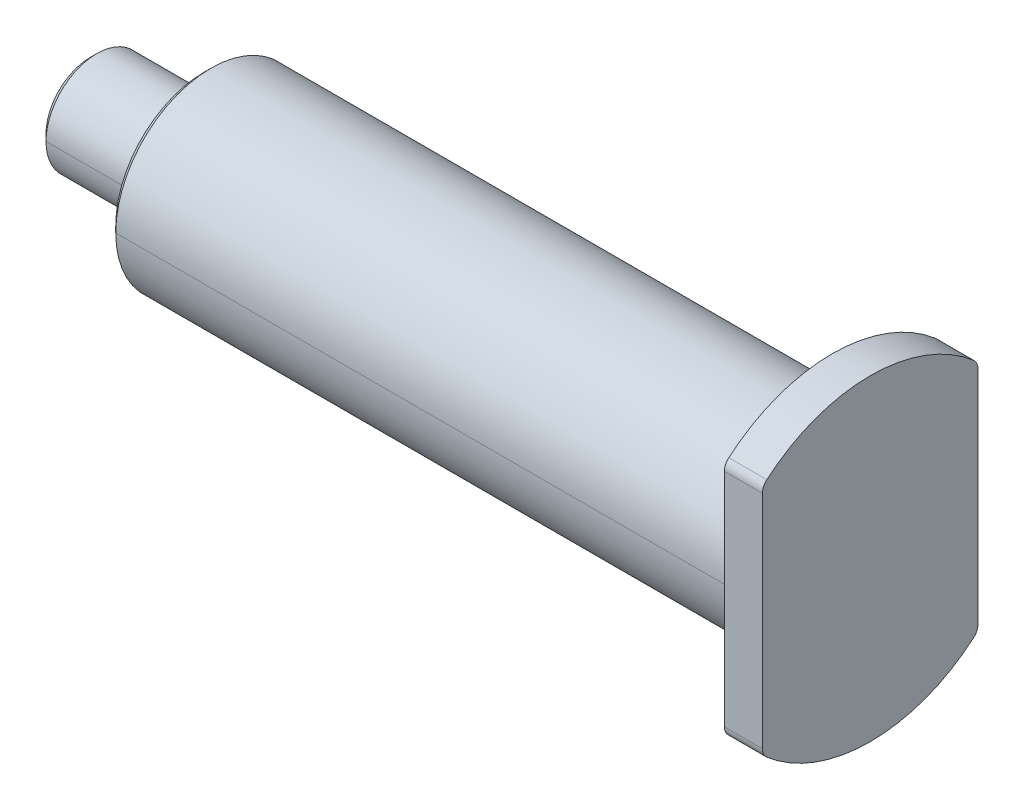
ISO-10303-21;
HEADER;
FILE_DESCRIPTION(('STEP AP214'),'2;1');
FILE_NAME('part.step','',(''),(''),'','','');
FILE_SCHEMA(('AUTOMOTIVE_DESIGN { 1 0 10303 214 1 1 1 1 }'));
ENDSEC;
DATA;
#1=APPLICATION_CONTEXT('core data for automotive mechanical design processes');
#2=APPLICATION_PROTOCOL_DEFINITION('international standard','automotive_design',2000,#1);
#3=PRODUCT_CONTEXT('',#1,'mechanical');
#4=PRODUCT('Part','Part','',(#3));
#5=PRODUCT_RELATED_PRODUCT_CATEGORY('part','',(#4));
#6=PRODUCT_DEFINITION_FORMATION('','',#4);
#7=PRODUCT_DEFINITION_CONTEXT('part definition',#1,'design');
#8=PRODUCT_DEFINITION('design','',#6,#7);
#9=PRODUCT_DEFINITION_SHAPE('','',#8);
#10=(LENGTH_UNIT() NAMED_UNIT(*) SI_UNIT(.MILLI.,.METRE.));
#11=(NAMED_UNIT(*) PLANE_ANGLE_UNIT() SI_UNIT($,.RADIAN.));
#12=(NAMED_UNIT(*) SI_UNIT($,.STERADIAN.) SOLID_ANGLE_UNIT());
#13=UNCERTAINTY_MEASURE_WITH_UNIT(LENGTH_MEASURE(1.E-05),#10,'distance_accuracy_value','');
#14=(GEOMETRIC_REPRESENTATION_CONTEXT(3) GLOBAL_UNCERTAINTY_ASSIGNED_CONTEXT((#13)) GLOBAL_UNIT_ASSIGNED_CONTEXT((#10,
#11,#12)) REPRESENTATION_CONTEXT('',''));
#15=CARTESIAN_POINT('',(0.,0.,0.));
#16=DIRECTION('',(0.,0.,1.));
#17=DIRECTION('',(1.,0.,0.));
#18=AXIS2_PLACEMENT_3D('',#15,#16,#17);
#19=CARTESIAN_POINT('',(150.5,-749.2177978871,1.5));
#20=DIRECTION('',(1.,0.,0.));
#21=DIRECTION('',(0.,0.,1.));
#22=AXIS2_PLACEMENT_3D('',#19,#20,#21);
#23=CYLINDRICAL_SURFACE('',#22,1.);
#24=CARTESIAN_POINT('',(153.5,-749.2177978871,1.5));
#25=DIRECTION('',(1.,0.,0.));
#26=DIRECTION('',(0.,-0.75806938148642,-0.652173913042217));
#27=AXIS2_PLACEMENT_3D('',#24,#25,#26);
#28=CIRCLE('',#27,1.);
#29=CARTESIAN_POINT('',(153.5,-749.9758672686,0.8478260869573));
#30=VERTEX_POINT('',#29);
#31=CARTESIAN_POINT('',(153.5,-749.2177978871,0.5));
#32=VERTEX_POINT('',#31);
#33=EDGE_CURVE('E250',#30,#32,#28,.T.);
#34=ORIENTED_EDGE('',*,*,#33,.F.);
#35=DIRECTION('',(1.,0.,0.));
#36=VECTOR('',#35,1.);
#37=CARTESIAN_POINT('',(150.5,-749.9758672686,0.8478260869573));
#38=LINE('',#37,#36);
#39=CARTESIAN_POINT('',(150.5,-749.9758672686,0.8478260869576));
#40=VERTEX_POINT('',#39);
#41=EDGE_CURVE('E11',#40,#30,#38,.T.);
#42=ORIENTED_EDGE('',*,*,#41,.F.);
#43=CARTESIAN_POINT('',(150.5,-749.2177978871,1.5));
#44=DIRECTION('',(-1.,0.,0.));
#45=DIRECTION('',(0.,1.136868377216E-13,-1.));
#46=AXIS2_PLACEMENT_3D('',#43,#44,#45);
#47=CIRCLE('',#46,1.);
#48=CARTESIAN_POINT('',(150.5,-749.2177978871,0.5));
#49=VERTEX_POINT('',#48);
#50=EDGE_CURVE('E260',#49,#40,#47,.T.);
#51=ORIENTED_EDGE('',*,*,#50,.F.);
#52=DIRECTION('',(1.,0.,0.));
#53=VECTOR('',#52,1.);
#54=CARTESIAN_POINT('',(150.5,-749.2177978871,0.5));
#55=LINE('',#54,#53);
#56=EDGE_CURVE('E275',#49,#32,#55,.T.);
#57=ORIENTED_EDGE('',*,*,#56,.T.);
#58=EDGE_LOOP('',(#34,#42,#51,#57));
#59=FACE_BOUND('',#58,.T.);
#60=ADVANCED_FACE('F17',(#59),#23,.T.);
#61=CARTESIAN_POINT('',(150.5,-740.5,9.));
#62=DIRECTION('',(1.,0.,0.));
#63=DIRECTION('',(0.,0.,1.));
#64=AXIS2_PLACEMENT_3D('',#61,#62,#63);
#65=CYLINDRICAL_SURFACE('',#64,12.5);
#66=CARTESIAN_POINT('',(150.5,-740.5,9.));
#67=DIRECTION('',(-1.,0.,0.));
#68=DIRECTION('',(0.,-0.758069381485401,-0.652173913043401));
#69=AXIS2_PLACEMENT_3D('',#66,#67,#68);
#70=CIRCLE('',#69,12.5);
#71=CARTESIAN_POINT('',(150.5,-749.9758672686,17.15217391304));
#72=VERTEX_POINT('',#71);
#73=EDGE_CURVE('E255',#40,#72,#70,.T.);
#74=ORIENTED_EDGE('',*,*,#73,.F.);
#75=ORIENTED_EDGE('',*,*,#41,.T.);
#76=CARTESIAN_POINT('',(153.5,-740.5,9.));
#77=DIRECTION('',(1.,0.,0.));
#78=DIRECTION('',(0.,-0.758069381485401,0.652173913043401));
#79=AXIS2_PLACEMENT_3D('',#76,#77,#78);
#80=CIRCLE('',#79,12.5);
#81=CARTESIAN_POINT('',(153.5,-749.9758672686,17.15217391304));
#82=VERTEX_POINT('',#81);
#83=EDGE_CURVE('E246',#82,#30,#80,.T.);
#84=ORIENTED_EDGE('',*,*,#83,.F.);
#85=DIRECTION('',(-1.,0.,0.));
#86=VECTOR('',#85,1.);
#87=CARTESIAN_POINT('',(153.5,-749.9758672686,17.15217391304));
#88=LINE('',#87,#86);
#89=EDGE_CURVE('E26',#82,#72,#88,.T.);
#90=ORIENTED_EDGE('',*,*,#89,.T.);
#91=EDGE_LOOP('',(#74,#75,#84,#90));
#92=FACE_BOUND('',#91,.T.);
#93=ADVANCED_FACE('F367',(#92),#65,.T.);
#94=CARTESIAN_POINT('',(150.5,-749.2177978871,16.5));
#95=DIRECTION('',(1.,0.,0.));
#96=DIRECTION('',(0.,0.,1.));
#97=AXIS2_PLACEMENT_3D('',#94,#95,#96);
#98=CYLINDRICAL_SURFACE('',#97,1.);
#99=CARTESIAN_POINT('',(153.5,-749.2177978871,16.5));
#100=DIRECTION('',(1.,0.,0.));
#101=DIRECTION('',(0.,1.136868377216E-13,1.));
#102=AXIS2_PLACEMENT_3D('',#99,#100,#101);
#103=CIRCLE('',#102,1.);
#104=CARTESIAN_POINT('',(153.5,-749.2177978871,17.5));
#105=VERTEX_POINT('',#104);
#106=EDGE_CURVE('E251',#105,#82,#103,.T.);
#107=ORIENTED_EDGE('',*,*,#106,.F.);
#108=DIRECTION('',(-1.,0.,0.));
#109=VECTOR('',#108,1.);
#110=CARTESIAN_POINT('',(153.5,-749.2177978871,17.5));
#111=LINE('',#110,#109);
#112=CARTESIAN_POINT('',(150.5,-749.2177978871,17.5));
#113=VERTEX_POINT('',#112);
#114=EDGE_CURVE('E179',#105,#113,#111,.T.);
#115=ORIENTED_EDGE('',*,*,#114,.T.);
#116=CARTESIAN_POINT('',(150.5,-749.2177978871,16.5));
#117=DIRECTION('',(-1.,0.,0.));
#118=DIRECTION('',(0.,-0.75806938148642,0.652173913042217));
#119=AXIS2_PLACEMENT_3D('',#116,#117,#118);
#120=CIRCLE('',#119,1.);
#121=EDGE_CURVE('E259',#72,#113,#120,.T.);
#122=ORIENTED_EDGE('',*,*,#121,.F.);
#123=ORIENTED_EDGE('',*,*,#89,.F.);
#124=EDGE_LOOP('',(#107,#115,#122,#123));
#125=FACE_BOUND('',#124,.T.);
#126=ADVANCED_FACE('F366',(#125),#98,.T.);
#127=CARTESIAN_POINT('',(150.5,-740.5,17.5));
#128=DIRECTION('',(0.,0.,1.));
#129=DIRECTION('',(1.,0.,0.));
#130=AXIS2_PLACEMENT_3D('',#127,#128,#129);
#131=PLANE('',#130);
#132=DIRECTION('',(0.,-1.,0.));
#133=VECTOR('',#132,1.);
#134=CARTESIAN_POINT('',(150.5,-731.7822021129,17.5));
#135=LINE('',#134,#133);
#136=CARTESIAN_POINT('',(150.5,-731.7822021129,17.5));
#137=VERTEX_POINT('',#136);
#138=EDGE_CURVE('E276',#137,#113,#135,.T.);
#139=ORIENTED_EDGE('',*,*,#138,.T.);
#140=ORIENTED_EDGE('',*,*,#114,.F.);
#141=DIRECTION('',(0.,-1.,0.));
#142=VECTOR('',#141,1.);
#143=CARTESIAN_POINT('',(153.5,-731.7822021129,17.5));
#144=LINE('',#143,#142);
#145=CARTESIAN_POINT('',(153.5,-731.7822021129,17.5));
#146=VERTEX_POINT('',#145);
#147=EDGE_CURVE('E245',#146,#105,#144,.T.);
#148=ORIENTED_EDGE('',*,*,#147,.F.);
#149=DIRECTION('',(1.,0.,0.));
#150=VECTOR('',#149,1.);
#151=CARTESIAN_POINT('',(150.5,-731.7822021129,17.5));
#152=LINE('',#151,#150);
#153=EDGE_CURVE('E177',#137,#146,#152,.T.);
#154=ORIENTED_EDGE('',*,*,#153,.F.);
#155=EDGE_LOOP('',(#139,#140,#148,#154));
#156=FACE_BOUND('',#155,.T.);
#157=ADVANCED_FACE('F370',(#156),#131,.T.);
#158=CARTESIAN_POINT('',(150.5,-731.7822021129,16.5));
#159=DIRECTION('',(1.,0.,0.));
#160=DIRECTION('',(0.,0.,1.));
#161=AXIS2_PLACEMENT_3D('',#158,#159,#160);
#162=CYLINDRICAL_SURFACE('',#161,1.);
#163=CARTESIAN_POINT('',(153.5,-731.7822021129,16.5));
#164=DIRECTION('',(1.,0.,0.));
#165=DIRECTION('',(0.,0.758069381486186,0.652173913042488));
#166=AXIS2_PLACEMENT_3D('',#163,#164,#165);
#167=CIRCLE('',#166,1.);
#168=CARTESIAN_POINT('',(153.5,-731.0241327314,17.15217391304));
#169=VERTEX_POINT('',#168);
#170=EDGE_CURVE('E241',#169,#146,#167,.T.);
#171=ORIENTED_EDGE('',*,*,#170,.F.);
#172=DIRECTION('',(1.,0.,0.));
#173=VECTOR('',#172,1.);
#174=CARTESIAN_POINT('',(150.5,-731.0241327314,17.15217391304));
#175=LINE('',#174,#173);
#176=CARTESIAN_POINT('',(150.5,-731.0241327314,17.15217391304));
#177=VERTEX_POINT('',#176);
#178=EDGE_CURVE('E356',#177,#169,#175,.T.);
#179=ORIENTED_EDGE('',*,*,#178,.F.);
#180=CARTESIAN_POINT('',(150.5,-731.7822021129,16.5));
#181=DIRECTION('',(-1.,0.,0.));
#182=DIRECTION('',(0.,0.,1.));
#183=AXIS2_PLACEMENT_3D('',#180,#181,#182);
#184=CIRCLE('',#183,1.);
#185=EDGE_CURVE('E279',#137,#177,#184,.T.);
#186=ORIENTED_EDGE('',*,*,#185,.F.);
#187=ORIENTED_EDGE('',*,*,#153,.T.);
#188=EDGE_LOOP('',(#171,#179,#186,#187));
#189=FACE_BOUND('',#188,.T.);
#190=ADVANCED_FACE('F374',(#189),#162,.T.);
#191=CARTESIAN_POINT('',(79.2867965644,-740.5,9.));
#192=DIRECTION('',(1.,0.,0.));
#193=DIRECTION('',(0.,0.,1.));
#194=AXIS2_PLACEMENT_3D('',#191,#192,#193);
#195=CYLINDRICAL_SURFACE('',#194,7.5);
#196=DIRECTION('',(1.,-4.881341589389E-11,-1.033117355826E-11));
#197=VECTOR('',#196,1.);
#198=CARTESIAN_POINT('',(101.4999999995,-740.4999999976,1.500000000506));
#199=LINE('',#198,#197);
#200=CARTESIAN_POINT('',(101.5,-740.5,1.5));
#201=VERTEX_POINT('',#200);
#202=CARTESIAN_POINT('',(150.5,-740.5,1.5));
#203=VERTEX_POINT('',#202);
#204=EDGE_CURVE('E196',#201,#203,#199,.T.);
#205=ORIENTED_EDGE('',*,*,#204,.T.);
#206=CARTESIAN_POINT('',(150.5,-740.5,9.));
#207=DIRECTION('',(1.,0.,0.));
#208=DIRECTION('',(0.,0.,1.));
#209=AXIS2_PLACEMENT_3D('',#206,#207,#208);
#210=CIRCLE('',#209,7.5);
#211=CARTESIAN_POINT('',(150.5,-740.5,16.5));
#212=VERTEX_POINT('',#211);
#213=EDGE_CURVE('E282',#212,#203,#210,.T.);
#214=ORIENTED_EDGE('',*,*,#213,.F.);
#215=DIRECTION('',(1.,4.881341589389E-11,1.033121887348E-11));
#216=VECTOR('',#215,1.);
#217=CARTESIAN_POINT('',(101.4999999995,-740.5000000024,16.49999999949));
#218=LINE('',#217,#216);
#219=CARTESIAN_POINT('',(101.5,-740.5,16.5));
#220=VERTEX_POINT('',#219);
#221=EDGE_CURVE('E194',#220,#212,#218,.T.);
#222=ORIENTED_EDGE('',*,*,#221,.F.);
#223=CARTESIAN_POINT('',(101.5,-740.5,9.));
#224=DIRECTION('',(-1.,0.,0.));
#225=DIRECTION('',(0.,0.,-1.));
#226=AXIS2_PLACEMENT_3D('',#223,#224,#225);
#227=CIRCLE('',#226,7.5);
#228=EDGE_CURVE('E138',#201,#220,#227,.T.);
#229=ORIENTED_EDGE('',*,*,#228,.F.);
#230=EDGE_LOOP('',(#205,#214,#222,#229));
#231=FACE_BOUND('',#230,.T.);
#232=ADVANCED_FACE('F298',(#231),#195,.T.);
#233=CARTESIAN_POINT('',(101.2499999995,-740.5,9.));
#234=DIRECTION('',(1.,0.,0.));
#235=DIRECTION('',(0.,0.,-1.));
#236=AXIS2_PLACEMENT_3D('',#233,#234,#235);
#237=CONICAL_SURFACE('',#236,7.249999999462,0.7853981633973);
#238=DIRECTION('',(0.707106781186597,-8.27039294000197E-10,-0.707106781186498));
#239=VECTOR('',#238,1.);
#240=CARTESIAN_POINT('',(100.9999999994,-740.499999997,2.00000000063));
#241=LINE('',#240,#239);
#242=CARTESIAN_POINT('',(101.,-740.5,2.));
#243=VERTEX_POINT('',#242);
#244=EDGE_CURVE('E207',#243,#201,#241,.T.);
#245=ORIENTED_EDGE('',*,*,#244,.T.);
#246=ORIENTED_EDGE('',*,*,#228,.T.);
#247=DIRECTION('',(0.707106781186597,8.26717739064697E-10,0.707106781186498));
#248=VECTOR('',#247,1.);
#249=CARTESIAN_POINT('',(100.9999999994,-740.500000003,15.99999999937));
#250=LINE('',#249,#248);
#251=CARTESIAN_POINT('',(101.,-740.5,16.));
#252=VERTEX_POINT('',#251);
#253=EDGE_CURVE('E203',#252,#220,#250,.T.);
#254=ORIENTED_EDGE('',*,*,#253,.F.);
#255=CARTESIAN_POINT('',(101.,-740.5,9.));
#256=DIRECTION('',(-1.,0.,0.));
#257=DIRECTION('',(0.,0.,-1.));
#258=AXIS2_PLACEMENT_3D('',#255,#256,#257);
#259=CIRCLE('',#258,7.);
#260=EDGE_CURVE('E215',#243,#252,#259,.T.);
#261=ORIENTED_EDGE('',*,*,#260,.F.);
#262=EDGE_LOOP('',(#245,#246,#254,#261));
#263=FACE_BOUND('',#262,.T.);
#264=ADVANCED_FACE('F233',(#263),#237,.T.);
#265=CARTESIAN_POINT('',(93.,-740.5,9.));
#266=DIRECTION('',(1.,0.,0.));
#267=DIRECTION('',(0.,0.,1.));
#268=AXIS2_PLACEMENT_3D('',#265,#266,#267);
#269=CYLINDRICAL_SURFACE('',#268,4.);
#270=DIRECTION('',(1.,-3.899191034602E-10,2.070584226523E-10));
#271=VECTOR('',#270,1.);
#272=CARTESIAN_POINT('',(92.49999999824,-740.4999999967,12.99999999824));
#273=LINE('',#272,#271);
#274=CARTESIAN_POINT('',(92.5,-740.5,13.));
#275=VERTEX_POINT('',#274);
#276=CARTESIAN_POINT('',(101.,-740.5,13.));
#277=VERTEX_POINT('',#276);
#278=EDGE_CURVE('E133',#275,#277,#273,.T.);
#279=ORIENTED_EDGE('',*,*,#278,.T.);
#280=CARTESIAN_POINT('',(101.,-740.5,9.));
#281=DIRECTION('',(1.,0.,0.));
#282=DIRECTION('',(0.,0.,-1.));
#283=AXIS2_PLACEMENT_3D('',#280,#281,#282);
#284=CIRCLE('',#283,4.);
#285=CARTESIAN_POINT('',(101.,-740.5,5.));
#286=VERTEX_POINT('',#285);
#287=EDGE_CURVE('E216',#286,#277,#284,.T.);
#288=ORIENTED_EDGE('',*,*,#287,.F.);
#289=DIRECTION('',(1.,3.899324783823E-10,-2.070577957029E-10));
#290=VECTOR('',#289,1.);
#291=CARTESIAN_POINT('',(92.49999999824,-740.5000000033,5.00000000176));
#292=LINE('',#291,#290);
#293=CARTESIAN_POINT('',(92.5,-740.5,5.));
#294=VERTEX_POINT('',#293);
#295=EDGE_CURVE('E135',#294,#286,#292,.T.);
#296=ORIENTED_EDGE('',*,*,#295,.F.);
#297=CARTESIAN_POINT('',(92.5,-740.5,9.));
#298=DIRECTION('',(-1.,0.,0.));
#299=DIRECTION('',(0.,0.,1.));
#300=AXIS2_PLACEMENT_3D('',#297,#298,#299);
#301=CIRCLE('',#300,4.);
#302=EDGE_CURVE('E129',#275,#294,#301,.T.);
#303=ORIENTED_EDGE('',*,*,#302,.F.);
#304=EDGE_LOOP('',(#279,#288,#296,#303));
#305=FACE_BOUND('',#304,.T.);
#306=ADVANCED_FACE('F130',(#305),#269,.T.);
#307=CARTESIAN_POINT('',(92.24999999832,-740.5,9.));
#308=DIRECTION('',(1.,0.,0.));
#309=DIRECTION('',(0.,0.,-1.));
#310=AXIS2_PLACEMENT_3D('',#307,#308,#309);
#311=CONICAL_SURFACE('',#310,3.749999998317,0.7853981633973);
#312=DIRECTION('',(0.707106781186597,-7.81378492899997E-10,0.707106781186498));
#313=VECTOR('',#312,1.);
#314=CARTESIAN_POINT('',(91.99999999795,-740.4999999961,12.49999999795));
#315=LINE('',#314,#313);
#316=CARTESIAN_POINT('',(92.,-740.5,12.5));
#317=VERTEX_POINT('',#316);
#318=EDGE_CURVE('E141',#317,#275,#315,.T.);
#319=ORIENTED_EDGE('',*,*,#318,.T.);
#320=ORIENTED_EDGE('',*,*,#302,.T.);
#321=DIRECTION('',(0.707106781186597,7.81217715432298E-10,-0.707106781186498));
#322=VECTOR('',#321,1.);
#323=CARTESIAN_POINT('',(91.99999999795,-740.5000000039,5.500000002053));
#324=LINE('',#323,#322);
#325=CARTESIAN_POINT('',(92.,-740.5,5.5));
#326=VERTEX_POINT('',#325);
#327=EDGE_CURVE('E148',#326,#294,#324,.T.);
#328=ORIENTED_EDGE('',*,*,#327,.F.);
#329=CARTESIAN_POINT('',(92.,-740.5,9.));
#330=DIRECTION('',(-1.,0.,0.));
#331=DIRECTION('',(0.,0.,1.));
#332=AXIS2_PLACEMENT_3D('',#329,#330,#331);
#333=CIRCLE('',#332,3.5);
#334=EDGE_CURVE('E38',#317,#326,#333,.T.);
#335=ORIENTED_EDGE('',*,*,#334,.F.);
#336=EDGE_LOOP('',(#319,#320,#328,#335));
#337=FACE_BOUND('',#336,.T.);
#338=ADVANCED_FACE('F143',(#337),#311,.T.);
#339=CARTESIAN_POINT('',(92.,-740.5,9.));
#340=DIRECTION('',(-1.,0.,0.));
#341=DIRECTION('',(0.,0.,1.));
#342=AXIS2_PLACEMENT_3D('',#339,#340,#341);
#343=PLANE('',#342);
#344=ORIENTED_EDGE('',*,*,#334,.T.);
#345=CARTESIAN_POINT('',(92.,-740.5,9.));
#346=DIRECTION('',(-1.,0.,0.));
#347=DIRECTION('',(0.,0.,-1.));
#348=AXIS2_PLACEMENT_3D('',#345,#346,#347);
#349=CIRCLE('',#348,3.5);
#350=EDGE_CURVE('E147',#326,#317,#349,.T.);
#351=ORIENTED_EDGE('',*,*,#350,.T.);
#352=EDGE_LOOP('',(#344,#351));
#353=FACE_BOUND('',#352,.T.);
#354=ADVANCED_FACE('F532',(#353),#343,.T.);
#355=CARTESIAN_POINT('',(92.24999999832,-740.5,9.));
#356=DIRECTION('',(1.,0.,0.));
#357=DIRECTION('',(0.,0.,-1.));
#358=AXIS2_PLACEMENT_3D('',#355,#356,#357);
#359=CONICAL_SURFACE('',#358,3.749999998317,0.7853981633973);
#360=ORIENTED_EDGE('',*,*,#327,.T.);
#361=CARTESIAN_POINT('',(92.5,-740.5,9.));
#362=DIRECTION('',(-1.,0.,0.));
#363=DIRECTION('',(0.,0.,-1.));
#364=AXIS2_PLACEMENT_3D('',#361,#362,#363);
#365=CIRCLE('',#364,4.);
#366=EDGE_CURVE('E151',#294,#275,#365,.T.);
#367=ORIENTED_EDGE('',*,*,#366,.T.);
#368=ORIENTED_EDGE('',*,*,#318,.F.);
#369=ORIENTED_EDGE('',*,*,#350,.F.);
#370=EDGE_LOOP('',(#360,#367,#368,#369));
#371=FACE_BOUND('',#370,.T.);
#372=ADVANCED_FACE('F152',(#371),#359,.T.);
#373=CARTESIAN_POINT('',(93.,-740.5,9.));
#374=DIRECTION('',(1.,0.,0.));
#375=DIRECTION('',(0.,0.,1.));
#376=AXIS2_PLACEMENT_3D('',#373,#374,#375);
#377=CYLINDRICAL_SURFACE('',#376,4.);
#378=ORIENTED_EDGE('',*,*,#295,.T.);
#379=CARTESIAN_POINT('',(101.,-740.5,9.));
#380=DIRECTION('',(1.,0.,0.));
#381=DIRECTION('',(0.,0.,1.));
#382=AXIS2_PLACEMENT_3D('',#379,#380,#381);
#383=CIRCLE('',#382,4.);
#384=EDGE_CURVE('E158',#277,#286,#383,.T.);
#385=ORIENTED_EDGE('',*,*,#384,.F.);
#386=ORIENTED_EDGE('',*,*,#278,.F.);
#387=ORIENTED_EDGE('',*,*,#366,.F.);
#388=EDGE_LOOP('',(#378,#385,#386,#387));
#389=FACE_BOUND('',#388,.T.);
#390=ADVANCED_FACE('F156',(#389),#377,.T.);
#391=CARTESIAN_POINT('',(101.,-740.5,9.));
#392=DIRECTION('',(-1.,0.,0.));
#393=DIRECTION('',(0.,0.,1.));
#394=AXIS2_PLACEMENT_3D('',#391,#392,#393);
#395=PLANE('',#394);
#396=ORIENTED_EDGE('',*,*,#287,.T.);
#397=ORIENTED_EDGE('',*,*,#384,.T.);
#398=EDGE_LOOP('',(#396,#397));
#399=FACE_BOUND('',#398,.T.);
#400=CARTESIAN_POINT('',(101.,-740.5,9.));
#401=DIRECTION('',(-1.,0.,0.));
#402=DIRECTION('',(0.,0.,1.));
#403=AXIS2_PLACEMENT_3D('',#400,#401,#402);
#404=CIRCLE('',#403,7.);
#405=EDGE_CURVE('E211',#252,#243,#404,.T.);
#406=ORIENTED_EDGE('',*,*,#405,.T.);
#407=ORIENTED_EDGE('',*,*,#260,.T.);
#408=EDGE_LOOP('',(#406,#407));
#409=FACE_BOUND('',#408,.T.);
#410=ADVANCED_FACE('F221',(#399,#409),#395,.T.);
#411=CARTESIAN_POINT('',(101.2499999995,-740.5,9.));
#412=DIRECTION('',(1.,0.,0.));
#413=DIRECTION('',(0.,0.,-1.));
#414=AXIS2_PLACEMENT_3D('',#411,#412,#413);
#415=CONICAL_SURFACE('',#414,7.249999999462,0.7853981633973);
#416=ORIENTED_EDGE('',*,*,#253,.T.);
#417=CARTESIAN_POINT('',(101.5,-740.5,9.));
#418=DIRECTION('',(-1.,0.,0.));
#419=DIRECTION('',(0.,0.,1.));
#420=AXIS2_PLACEMENT_3D('',#417,#418,#419);
#421=CIRCLE('',#420,7.5);
#422=EDGE_CURVE('E199',#220,#201,#421,.T.);
#423=ORIENTED_EDGE('',*,*,#422,.T.);
#424=ORIENTED_EDGE('',*,*,#244,.F.);
#425=ORIENTED_EDGE('',*,*,#405,.F.);
#426=EDGE_LOOP('',(#416,#423,#424,#425));
#427=FACE_BOUND('',#426,.T.);
#428=ADVANCED_FACE('F224',(#427),#415,.T.);
#429=CARTESIAN_POINT('',(79.2867965644,-740.5,9.));
#430=DIRECTION('',(1.,0.,0.));
#431=DIRECTION('',(0.,0.,1.));
#432=AXIS2_PLACEMENT_3D('',#429,#430,#431);
#433=CYLINDRICAL_SURFACE('',#432,7.5);
#434=ORIENTED_EDGE('',*,*,#221,.T.);
#435=CARTESIAN_POINT('',(150.5,-740.5,9.));
#436=DIRECTION('',(1.,0.,0.));
#437=DIRECTION('',(0.,0.,-1.));
#438=AXIS2_PLACEMENT_3D('',#435,#436,#437);
#439=CIRCLE('',#438,7.5);
#440=EDGE_CURVE('E285',#203,#212,#439,.T.);
#441=ORIENTED_EDGE('',*,*,#440,.F.);
#442=ORIENTED_EDGE('',*,*,#204,.F.);
#443=ORIENTED_EDGE('',*,*,#422,.F.);
#444=EDGE_LOOP('',(#434,#441,#442,#443));
#445=FACE_BOUND('',#444,.T.);
#446=ADVANCED_FACE('F296',(#445),#433,.T.);
#447=CARTESIAN_POINT('',(150.5,-740.5,9.));
#448=DIRECTION('',(-1.,0.,0.));
#449=DIRECTION('',(0.,0.,1.));
#450=AXIS2_PLACEMENT_3D('',#447,#448,#449);
#451=PLANE('',#450);
#452=ORIENTED_EDGE('',*,*,#213,.T.);
#453=ORIENTED_EDGE('',*,*,#440,.T.);
#454=EDGE_LOOP('',(#452,#453));
#455=FACE_BOUND('',#454,.T.);
#456=DIRECTION('',(0.,-1.,0.));
#457=VECTOR('',#456,1.);
#458=CARTESIAN_POINT('',(150.5,-731.7822021129,0.5));
#459=LINE('',#458,#457);
#460=CARTESIAN_POINT('',(150.5,-731.7822021129,0.5));
#461=VERTEX_POINT('',#460);
#462=EDGE_CURVE('E267',#461,#49,#459,.T.);
#463=ORIENTED_EDGE('',*,*,#462,.T.);
#464=ORIENTED_EDGE('',*,*,#50,.T.);
#465=ORIENTED_EDGE('',*,*,#73,.T.);
#466=ORIENTED_EDGE('',*,*,#121,.T.);
#467=ORIENTED_EDGE('',*,*,#138,.F.);
#468=ORIENTED_EDGE('',*,*,#185,.T.);
#469=CARTESIAN_POINT('',(150.5,-740.5,9.));
#470=DIRECTION('',(-1.,0.,0.));
#471=DIRECTION('',(0.,0.758069381485401,0.652173913043401));
#472=AXIS2_PLACEMENT_3D('',#469,#470,#471);
#473=CIRCLE('',#472,12.5);
#474=CARTESIAN_POINT('',(150.5,-731.0241327314,0.8478260869572));
#475=VERTEX_POINT('',#474);
#476=EDGE_CURVE('E353',#177,#475,#473,.T.);
#477=ORIENTED_EDGE('',*,*,#476,.T.);
#478=CARTESIAN_POINT('',(150.5,-731.7822021129,1.5));
#479=DIRECTION('',(-1.,0.,0.));
#480=DIRECTION('',(0.,0.758069381486144,-0.652173913042538));
#481=AXIS2_PLACEMENT_3D('',#478,#479,#480);
#482=CIRCLE('',#481,1.);
#483=EDGE_CURVE('E340',#475,#461,#482,.T.);
#484=ORIENTED_EDGE('',*,*,#483,.T.);
#485=EDGE_LOOP('',(#463,#464,#465,#466,#467,#468,#477,#484));
#486=FACE_BOUND('',#485,.T.);
#487=ADVANCED_FACE('F365',(#455,#486),#451,.T.);
#488=CARTESIAN_POINT('',(150.5,-740.5,0.5));
#489=DIRECTION('',(0.,0.,1.));
#490=DIRECTION('',(1.,0.,0.));
#491=AXIS2_PLACEMENT_3D('',#488,#489,#490);
#492=PLANE('',#491);
#493=DIRECTION('',(0.,-1.,0.));
#494=VECTOR('',#493,1.);
#495=CARTESIAN_POINT('',(153.5,-731.7822021129,0.5));
#496=LINE('',#495,#494);
#497=CARTESIAN_POINT('',(153.5,-731.7822021129,0.5));
#498=VERTEX_POINT('',#497);
#499=EDGE_CURVE('E271',#498,#32,#496,.T.);
#500=ORIENTED_EDGE('',*,*,#499,.T.);
#501=ORIENTED_EDGE('',*,*,#56,.F.);
#502=ORIENTED_EDGE('',*,*,#462,.F.);
#503=DIRECTION('',(-1.,0.,0.));
#504=VECTOR('',#503,1.);
#505=CARTESIAN_POINT('',(153.5,-731.7822021129,0.5));
#506=LINE('',#505,#504);
#507=EDGE_CURVE('E335',#498,#461,#506,.T.);
#508=ORIENTED_EDGE('',*,*,#507,.F.);
#509=EDGE_LOOP('',(#500,#501,#502,#508));
#510=FACE_BOUND('',#509,.T.);
#511=ADVANCED_FACE('F336',(#510),#492,.F.);
#512=CARTESIAN_POINT('',(153.5,-740.5,9.));
#513=DIRECTION('',(-1.,0.,0.));
#514=DIRECTION('',(0.,0.,1.));
#515=AXIS2_PLACEMENT_3D('',#512,#513,#514);
#516=PLANE('',#515);
#517=CARTESIAN_POINT('',(153.5,-740.5,9.));
#518=DIRECTION('',(1.,0.,0.));
#519=DIRECTION('',(0.,0.758069381485401,-0.652173913043401));
#520=AXIS2_PLACEMENT_3D('',#517,#518,#519);
#521=CIRCLE('',#520,12.5);
#522=CARTESIAN_POINT('',(153.5,-731.0241327314,0.8478260869572));
#523=VERTEX_POINT('',#522);
#524=EDGE_CURVE('E239',#523,#169,#521,.T.);
#525=ORIENTED_EDGE('',*,*,#524,.T.);
#526=ORIENTED_EDGE('',*,*,#170,.T.);
#527=ORIENTED_EDGE('',*,*,#147,.T.);
#528=ORIENTED_EDGE('',*,*,#106,.T.);
#529=ORIENTED_EDGE('',*,*,#83,.T.);
#530=ORIENTED_EDGE('',*,*,#33,.T.);
#531=ORIENTED_EDGE('',*,*,#499,.F.);
#532=CARTESIAN_POINT('',(153.5,-731.7822021129,1.5));
#533=DIRECTION('',(1.,0.,0.));
#534=DIRECTION('',(0.,0.,-1.));
#535=AXIS2_PLACEMENT_3D('',#532,#533,#534);
#536=CIRCLE('',#535,1.);
#537=EDGE_CURVE('E332',#498,#523,#536,.T.);
#538=ORIENTED_EDGE('',*,*,#537,.T.);
#539=EDGE_LOOP('',(#525,#526,#527,#528,#529,#530,#531,#538));
#540=FACE_BOUND('',#539,.T.);
#541=ADVANCED_FACE('F330',(#540),#516,.F.);
#542=CARTESIAN_POINT('',(150.5,-740.5,9.));
#543=DIRECTION('',(1.,0.,0.));
#544=DIRECTION('',(0.,0.,1.));
#545=AXIS2_PLACEMENT_3D('',#542,#543,#544);
#546=CYLINDRICAL_SURFACE('',#545,12.5);
#547=ORIENTED_EDGE('',*,*,#476,.F.);
#548=ORIENTED_EDGE('',*,*,#178,.T.);
#549=ORIENTED_EDGE('',*,*,#524,.F.);
#550=DIRECTION('',(-1.,0.,0.));
#551=VECTOR('',#550,1.);
#552=CARTESIAN_POINT('',(153.5,-731.0241327314,0.8478260869572));
#553=LINE('',#552,#551);
#554=EDGE_CURVE('E343',#523,#475,#553,.T.);
#555=ORIENTED_EDGE('',*,*,#554,.T.);
#556=EDGE_LOOP('',(#547,#548,#549,#555));
#557=FACE_BOUND('',#556,.T.);
#558=ADVANCED_FACE('F376',(#557),#546,.T.);
#559=CARTESIAN_POINT('',(150.5,-731.7822021129,1.5));
#560=DIRECTION('',(1.,0.,0.));
#561=DIRECTION('',(0.,0.,1.));
#562=AXIS2_PLACEMENT_3D('',#559,#560,#561);
#563=CYLINDRICAL_SURFACE('',#562,1.);
#564=ORIENTED_EDGE('',*,*,#537,.F.);
#565=ORIENTED_EDGE('',*,*,#507,.T.);
#566=ORIENTED_EDGE('',*,*,#483,.F.);
#567=ORIENTED_EDGE('',*,*,#554,.F.);
#568=EDGE_LOOP('',(#564,#565,#566,#567));
#569=FACE_BOUND('',#568,.T.);
#570=ADVANCED_FACE('F342',(#569),#563,.T.);
#571=CLOSED_SHELL('',(#60,#93,#126,#157,#190,#232,#264,#306,#338,#354,#372,#390,#410,#428,#446,
#487,#511,#541,#558,#570));
#572=MANIFOLD_SOLID_BREP('B1',#571);
#573=ADVANCED_BREP_SHAPE_REPRESENTATION('',(#18,#572),#14);
#574=SHAPE_DEFINITION_REPRESENTATION(#9,#573);
ENDSEC;
END-ISO-10303-21;
